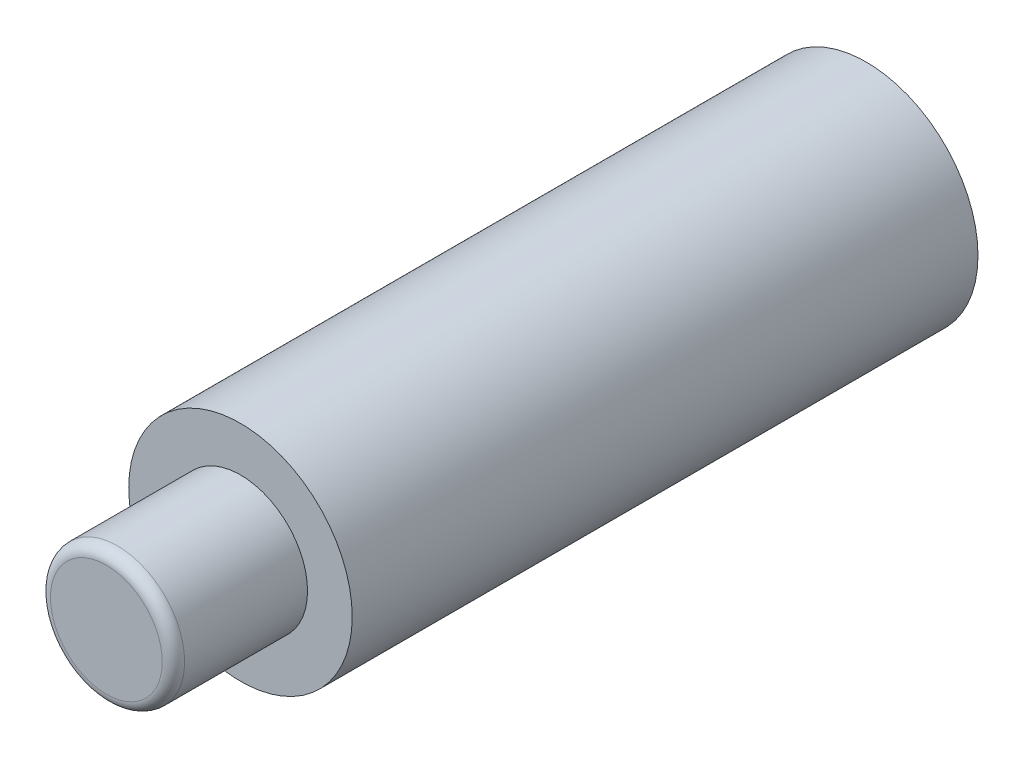
ISO-10303-21;
HEADER;
FILE_DESCRIPTION(('STEP AP214'),'2;1');
FILE_NAME('part.step','',(''),(''),'','','');
FILE_SCHEMA(('AUTOMOTIVE_DESIGN { 1 0 10303 214 1 1 1 1 }'));
ENDSEC;
DATA;
#1=APPLICATION_CONTEXT('core data for automotive mechanical design processes');
#2=APPLICATION_PROTOCOL_DEFINITION('international standard','automotive_design',2000,#1);
#3=PRODUCT_CONTEXT('',#1,'mechanical');
#4=PRODUCT('Part','Part','',(#3));
#5=PRODUCT_RELATED_PRODUCT_CATEGORY('part','',(#4));
#6=PRODUCT_DEFINITION_FORMATION('','',#4);
#7=PRODUCT_DEFINITION_CONTEXT('part definition',#1,'design');
#8=PRODUCT_DEFINITION('design','',#6,#7);
#9=PRODUCT_DEFINITION_SHAPE('','',#8);
#10=(LENGTH_UNIT() NAMED_UNIT(*) SI_UNIT(.MILLI.,.METRE.));
#11=(NAMED_UNIT(*) PLANE_ANGLE_UNIT() SI_UNIT($,.RADIAN.));
#12=(NAMED_UNIT(*) SI_UNIT($,.STERADIAN.) SOLID_ANGLE_UNIT());
#13=UNCERTAINTY_MEASURE_WITH_UNIT(LENGTH_MEASURE(1.E-05),#10,'distance_accuracy_value','');
#14=(GEOMETRIC_REPRESENTATION_CONTEXT(3) GLOBAL_UNCERTAINTY_ASSIGNED_CONTEXT((#13)) GLOBAL_UNIT_ASSIGNED_CONTEXT((#10,
#11,#12)) REPRESENTATION_CONTEXT('',''));
#15=CARTESIAN_POINT('',(0.,0.,0.));
#16=DIRECTION('',(0.,0.,1.));
#17=DIRECTION('',(1.,0.,0.));
#18=AXIS2_PLACEMENT_3D('',#15,#16,#17);
#19=CARTESIAN_POINT('',(0.,0.,140.));
#20=DIRECTION('',(0.,0.,-1.));
#21=DIRECTION('',(-1.,0.,0.));
#22=AXIS2_PLACEMENT_3D('',#19,#20,#21);
#23=CYLINDRICAL_SURFACE('',#22,25.);
#24=CARTESIAN_POINT('',(0.,0.,140.));
#25=DIRECTION('',(0.,0.,1.));
#26=DIRECTION('',(1.,0.,0.));
#27=AXIS2_PLACEMENT_3D('',#24,#25,#26);
#28=CIRCLE('',#27,25.);
#29=CARTESIAN_POINT('',(25.,0.,140.));
#30=VERTEX_POINT('',#29);
#31=EDGE_CURVE('E55',#30,#30,#28,.T.);
#32=ORIENTED_EDGE('',*,*,#31,.F.);
#33=EDGE_LOOP('',(#32));
#34=FACE_BOUND('',#33,.T.);
#35=CARTESIAN_POINT('',(0.,0.,0.));
#36=DIRECTION('',(0.,0.,1.));
#37=DIRECTION('',(1.,0.,0.));
#38=AXIS2_PLACEMENT_3D('',#35,#36,#37);
#39=CIRCLE('',#38,25.);
#40=CARTESIAN_POINT('',(25.,0.,0.));
#41=VERTEX_POINT('',#40);
#42=EDGE_CURVE('E58',#41,#41,#39,.T.);
#43=ORIENTED_EDGE('',*,*,#42,.T.);
#44=EDGE_LOOP('',(#43));
#45=FACE_BOUND('',#44,.T.);
#46=ADVANCED_FACE('F37',(#34,#45),#23,.T.);
#47=CARTESIAN_POINT('',(0.,0.,140.));
#48=DIRECTION('',(0.,0.,1.));
#49=DIRECTION('',(1.,0.,0.));
#50=AXIS2_PLACEMENT_3D('',#47,#48,#49);
#51=PLANE('',#50);
#52=CARTESIAN_POINT('',(0.,0.,140.));
#53=DIRECTION('',(0.,0.,1.));
#54=DIRECTION('',(1.,0.,0.));
#55=AXIS2_PLACEMENT_3D('',#52,#53,#54);
#56=CIRCLE('',#55,15.);
#57=CARTESIAN_POINT('',(15.,0.,140.));
#58=VERTEX_POINT('',#57);
#59=EDGE_CURVE('E50',#58,#58,#56,.T.);
#60=ORIENTED_EDGE('',*,*,#59,.F.);
#61=EDGE_LOOP('',(#60));
#62=FACE_BOUND('',#61,.T.);
#63=ORIENTED_EDGE('',*,*,#31,.T.);
#64=EDGE_LOOP('',(#63));
#65=FACE_BOUND('',#64,.T.);
#66=ADVANCED_FACE('F66',(#62,#65),#51,.T.);
#67=CARTESIAN_POINT('',(0.,0.,0.));
#68=DIRECTION('',(0.,0.,1.));
#69=DIRECTION('',(1.,0.,0.));
#70=AXIS2_PLACEMENT_3D('',#67,#68,#69);
#71=PLANE('',#70);
#72=ORIENTED_EDGE('',*,*,#42,.F.);
#73=EDGE_LOOP('',(#72));
#74=FACE_BOUND('',#73,.T.);
#75=ADVANCED_FACE('F72',(#74),#71,.F.);
#76=CARTESIAN_POINT('',(0.,0.,170.));
#77=DIRECTION('',(0.,0.,-1.));
#78=DIRECTION('',(-1.,0.,0.));
#79=AXIS2_PLACEMENT_3D('',#76,#77,#78);
#80=CYLINDRICAL_SURFACE('',#79,15.);
#81=CARTESIAN_POINT('',(0.,0.,167.5));
#82=DIRECTION('',(0.,0.,1.));
#83=DIRECTION('',(1.,0.,0.));
#84=AXIS2_PLACEMENT_3D('',#81,#82,#83);
#85=CIRCLE('',#84,15.);
#86=CARTESIAN_POINT('',(15.,0.,167.5));
#87=VERTEX_POINT('',#86);
#88=EDGE_CURVE('E10',#87,#87,#85,.F.);
#89=ORIENTED_EDGE('',*,*,#88,.T.);
#90=EDGE_LOOP('',(#89));
#91=FACE_BOUND('',#90,.T.);
#92=ORIENTED_EDGE('',*,*,#59,.T.);
#93=EDGE_LOOP('',(#92));
#94=FACE_BOUND('',#93,.T.);
#95=ADVANCED_FACE('F74',(#91,#94),#80,.T.);
#96=CARTESIAN_POINT('',(0.,0.,170.));
#97=DIRECTION('',(0.,0.,1.));
#98=DIRECTION('',(1.,0.,0.));
#99=AXIS2_PLACEMENT_3D('',#96,#97,#98);
#100=PLANE('',#99);
#101=CARTESIAN_POINT('',(0.,0.,170.));
#102=DIRECTION('',(0.,0.,1.));
#103=DIRECTION('',(1.,0.,0.));
#104=AXIS2_PLACEMENT_3D('',#101,#102,#103);
#105=CIRCLE('',#104,12.5);
#106=CARTESIAN_POINT('',(12.5,0.,170.));
#107=VERTEX_POINT('',#106);
#108=EDGE_CURVE('E45',#107,#107,#105,.T.);
#109=ORIENTED_EDGE('',*,*,#108,.T.);
#110=EDGE_LOOP('',(#109));
#111=FACE_BOUND('',#110,.T.);
#112=ADVANCED_FACE('F80',(#111),#100,.T.);
#113=CARTESIAN_POINT('',(0.,0.,167.5));
#114=DIRECTION('',(0.,0.,1.));
#115=DIRECTION('',(1.,0.,0.));
#116=AXIS2_PLACEMENT_3D('',#113,#114,#115);
#117=TOROIDAL_SURFACE('',#116,12.5,2.5);
#118=ORIENTED_EDGE('',*,*,#88,.F.);
#119=EDGE_LOOP('',(#118));
#120=FACE_BOUND('',#119,.T.);
#121=ORIENTED_EDGE('',*,*,#108,.F.);
#122=EDGE_LOOP('',(#121));
#123=FACE_BOUND('',#122,.T.);
#124=ADVANCED_FACE('F39',(#120,#123),#117,.T.);
#125=CLOSED_SHELL('',(#46,#66,#75,#95,#112,#124));
#126=MANIFOLD_SOLID_BREP('B2',#125);
#127=ADVANCED_BREP_SHAPE_REPRESENTATION('',(#18,#126),#14);
#128=SHAPE_DEFINITION_REPRESENTATION(#9,#127);
ENDSEC;
END-ISO-10303-21;
